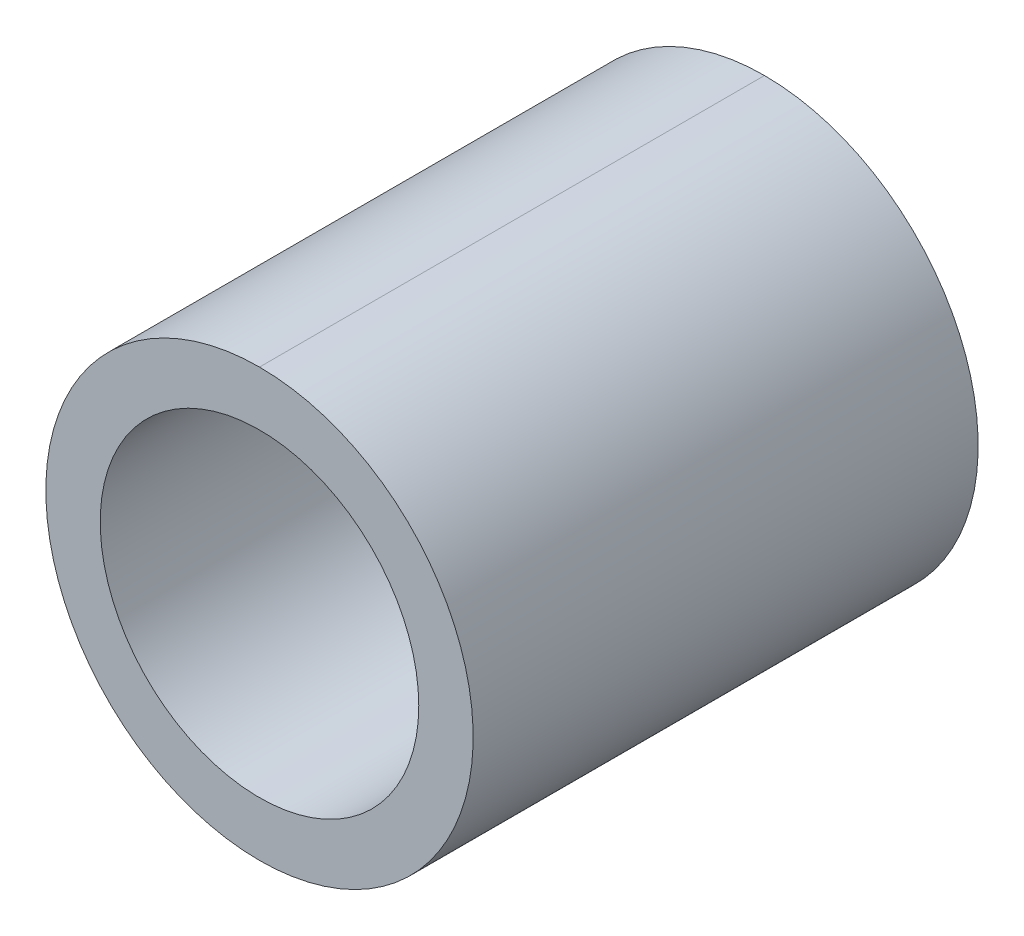
ISO-10303-21;
HEADER;
FILE_DESCRIPTION(('STEP AP214'),'2;1');
FILE_NAME('part.step','',(''),(''),'','','');
FILE_SCHEMA(('AUTOMOTIVE_DESIGN { 1 0 10303 214 1 1 1 1 }'));
ENDSEC;
DATA;
#1=APPLICATION_CONTEXT('core data for automotive mechanical design processes');
#2=APPLICATION_PROTOCOL_DEFINITION('international standard','automotive_design',2000,#1);
#3=PRODUCT_CONTEXT('',#1,'mechanical');
#4=PRODUCT('Part','Part','',(#3));
#5=PRODUCT_RELATED_PRODUCT_CATEGORY('part','',(#4));
#6=PRODUCT_DEFINITION_FORMATION('','',#4);
#7=PRODUCT_DEFINITION_CONTEXT('part definition',#1,'design');
#8=PRODUCT_DEFINITION('design','',#6,#7);
#9=PRODUCT_DEFINITION_SHAPE('','',#8);
#10=(LENGTH_UNIT() NAMED_UNIT(*) SI_UNIT(.MILLI.,.METRE.));
#11=(NAMED_UNIT(*) PLANE_ANGLE_UNIT() SI_UNIT($,.RADIAN.));
#12=(NAMED_UNIT(*) SI_UNIT($,.STERADIAN.) SOLID_ANGLE_UNIT());
#13=UNCERTAINTY_MEASURE_WITH_UNIT(LENGTH_MEASURE(1.E-05),#10,'distance_accuracy_value','');
#14=(GEOMETRIC_REPRESENTATION_CONTEXT(3) GLOBAL_UNCERTAINTY_ASSIGNED_CONTEXT((#13)) GLOBAL_UNIT_ASSIGNED_CONTEXT((#10,
#11,#12)) REPRESENTATION_CONTEXT('',''));
#15=CARTESIAN_POINT('',(0.,0.,0.));
#16=DIRECTION('',(0.,0.,1.));
#17=DIRECTION('',(1.,0.,0.));
#18=AXIS2_PLACEMENT_3D('',#15,#16,#17);
#19=CARTESIAN_POINT('',(0.,0.,130.));
#20=DIRECTION('',(0.,0.,-1.));
#21=DIRECTION('',(-1.,0.,0.));
#22=AXIS2_PLACEMENT_3D('',#19,#20,#21);
#23=CYLINDRICAL_SURFACE('',#22,55.);
#24=DIRECTION('',(0.,0.,-1.));
#25=VECTOR('',#24,1.);
#26=CARTESIAN_POINT('',(0.,55.,130.));
#27=LINE('',#26,#25);
#28=CARTESIAN_POINT('',(0.,55.,130.));
#29=VERTEX_POINT('',#28);
#30=CARTESIAN_POINT('',(0.,55.,0.));
#31=VERTEX_POINT('',#30);
#32=EDGE_CURVE('E11',#29,#31,#27,.T.);
#33=ORIENTED_EDGE('',*,*,#32,.F.);
#34=CARTESIAN_POINT('',(0.,0.,130.));
#35=DIRECTION('',(0.,0.,1.));
#36=DIRECTION('',(1.,0.,0.));
#37=AXIS2_PLACEMENT_3D('',#34,#35,#36);
#38=CIRCLE('',#37,55.);
#39=CARTESIAN_POINT('',(0.,-55.,130.));
#40=VERTEX_POINT('',#39);
#41=EDGE_CURVE('E66',#40,#29,#38,.T.);
#42=ORIENTED_EDGE('',*,*,#41,.F.);
#43=DIRECTION('',(0.,0.,-1.));
#44=VECTOR('',#43,1.);
#45=CARTESIAN_POINT('',(0.,-55.,130.));
#46=LINE('',#45,#44);
#47=CARTESIAN_POINT('',(0.,-55.,0.));
#48=VERTEX_POINT('',#47);
#49=EDGE_CURVE('E49',#48,#40,#46,.F.);
#50=ORIENTED_EDGE('',*,*,#49,.F.);
#51=CARTESIAN_POINT('',(0.,0.,0.));
#52=DIRECTION('',(0.,0.,1.));
#53=DIRECTION('',(1.,0.,0.));
#54=AXIS2_PLACEMENT_3D('',#51,#52,#53);
#55=CIRCLE('',#54,55.);
#56=EDGE_CURVE('E68',#48,#31,#55,.T.);
#57=ORIENTED_EDGE('',*,*,#56,.T.);
#58=EDGE_LOOP('',(#33,#42,#50,#57));
#59=FACE_BOUND('',#58,.T.);
#60=ADVANCED_FACE('F40',(#59),#23,.T.);
#61=EDGE_CURVE('E72',#29,#40,#38,.T.);
#62=ORIENTED_EDGE('',*,*,#61,.F.);
#63=ORIENTED_EDGE('',*,*,#32,.T.);
#64=EDGE_CURVE('E74',#31,#48,#55,.T.);
#65=ORIENTED_EDGE('',*,*,#64,.T.);
#66=ORIENTED_EDGE('',*,*,#49,.T.);
#67=EDGE_LOOP('',(#62,#63,#65,#66));
#68=FACE_BOUND('',#67,.T.);
#69=ADVANCED_FACE('F42',(#68),#23,.T.);
#70=CARTESIAN_POINT('',(0.,0.,130.));
#71=DIRECTION('',(0.,0.,1.));
#72=DIRECTION('',(1.,0.,0.));
#73=AXIS2_PLACEMENT_3D('',#70,#71,#72);
#74=PLANE('',#73);
#75=CARTESIAN_POINT('',(0.,0.,130.));
#76=DIRECTION('',(0.,0.,1.));
#77=DIRECTION('',(1.,0.,0.));
#78=AXIS2_PLACEMENT_3D('',#75,#76,#77);
#79=CIRCLE('',#78,41.);
#80=CARTESIAN_POINT('',(41.,0.,130.));
#81=VERTEX_POINT('',#80);
#82=EDGE_CURVE('E80',#81,#81,#79,.T.);
#83=ORIENTED_EDGE('',*,*,#82,.F.);
#84=EDGE_LOOP('',(#83));
#85=FACE_BOUND('',#84,.T.);
#86=ORIENTED_EDGE('',*,*,#61,.T.);
#87=ORIENTED_EDGE('',*,*,#41,.T.);
#88=EDGE_LOOP('',(#86,#87));
#89=FACE_BOUND('',#88,.T.);
#90=ADVANCED_FACE('F71',(#85,#89),#74,.T.);
#91=CARTESIAN_POINT('',(0.,0.,0.));
#92=DIRECTION('',(0.,0.,1.));
#93=DIRECTION('',(1.,0.,0.));
#94=AXIS2_PLACEMENT_3D('',#91,#92,#93);
#95=PLANE('',#94);
#96=ORIENTED_EDGE('',*,*,#64,.F.);
#97=ORIENTED_EDGE('',*,*,#56,.F.);
#98=EDGE_LOOP('',(#96,#97));
#99=FACE_BOUND('',#98,.T.);
#100=ADVANCED_FACE('F96',(#99),#95,.F.);
#101=CARTESIAN_POINT('',(0.,0.,9.99999999999999));
#102=DIRECTION('',(0.,0.,1.));
#103=DIRECTION('',(1.,0.,0.));
#104=AXIS2_PLACEMENT_3D('',#101,#102,#103);
#105=CYLINDRICAL_SURFACE('',#104,41.);
#106=CARTESIAN_POINT('',(0.,0.,9.99999999999999));
#107=DIRECTION('',(0.,0.,1.));
#108=DIRECTION('',(1.,0.,0.));
#109=AXIS2_PLACEMENT_3D('',#106,#107,#108);
#110=CIRCLE('',#109,41.);
#111=CARTESIAN_POINT('',(41.,0.,9.99999999999999));
#112=VERTEX_POINT('',#111);
#113=EDGE_CURVE('E84',#112,#112,#110,.T.);
#114=CARTESIAN_POINT('',(41.,0.,9.99999999999999));
#115=CARTESIAN_POINT('',(41.,0.,11.25));
#116=CARTESIAN_POINT('',(41.,0.,12.5));
#117=CARTESIAN_POINT('',(41.,0.,15.));
#118=CARTESIAN_POINT('',(41.,0.,16.25));
#119=CARTESIAN_POINT('',(41.,0.,18.75));
#120=CARTESIAN_POINT('',(41.,0.,20.));
#121=CARTESIAN_POINT('',(41.,0.,22.5));
#122=CARTESIAN_POINT('',(41.,0.,23.75));
#123=CARTESIAN_POINT('',(41.,0.,26.25));
#124=CARTESIAN_POINT('',(41.,0.,27.5));
#125=CARTESIAN_POINT('',(41.,0.,30.));
#126=CARTESIAN_POINT('',(41.,0.,31.25));
#127=CARTESIAN_POINT('',(41.,0.,33.75));
#128=CARTESIAN_POINT('',(41.,0.,35.));
#129=CARTESIAN_POINT('',(41.,0.,37.5));
#130=CARTESIAN_POINT('',(41.,0.,38.75));
#131=CARTESIAN_POINT('',(41.,0.,41.25));
#132=CARTESIAN_POINT('',(41.,0.,42.5));
#133=CARTESIAN_POINT('',(41.,0.,45.));
#134=CARTESIAN_POINT('',(41.,0.,46.25));
#135=CARTESIAN_POINT('',(41.,0.,48.75));
#136=CARTESIAN_POINT('',(41.,0.,50.));
#137=CARTESIAN_POINT('',(41.,0.,52.5));
#138=CARTESIAN_POINT('',(41.,0.,53.75));
#139=CARTESIAN_POINT('',(41.,0.,56.25));
#140=CARTESIAN_POINT('',(41.,0.,57.5));
#141=CARTESIAN_POINT('',(41.,0.,60.));
#142=CARTESIAN_POINT('',(41.,0.,61.25));
#143=CARTESIAN_POINT('',(41.,0.,63.75));
#144=CARTESIAN_POINT('',(41.,0.,65.));
#145=CARTESIAN_POINT('',(41.,0.,67.5));
#146=CARTESIAN_POINT('',(41.,0.,68.75));
#147=CARTESIAN_POINT('',(41.,0.,71.25));
#148=CARTESIAN_POINT('',(41.,0.,72.5));
#149=CARTESIAN_POINT('',(41.,0.,75.));
#150=CARTESIAN_POINT('',(41.,0.,76.25));
#151=CARTESIAN_POINT('',(41.,0.,78.75));
#152=CARTESIAN_POINT('',(41.,0.,80.));
#153=CARTESIAN_POINT('',(41.,0.,82.5));
#154=CARTESIAN_POINT('',(41.,0.,83.75));
#155=CARTESIAN_POINT('',(41.,0.,86.25));
#156=CARTESIAN_POINT('',(41.,0.,87.5));
#157=CARTESIAN_POINT('',(41.,0.,90.));
#158=CARTESIAN_POINT('',(41.,0.,91.25));
#159=CARTESIAN_POINT('',(41.,0.,93.75));
#160=CARTESIAN_POINT('',(41.,0.,95.));
#161=CARTESIAN_POINT('',(41.,0.,97.5));
#162=CARTESIAN_POINT('',(41.,0.,98.75));
#163=CARTESIAN_POINT('',(41.,0.,101.25));
#164=CARTESIAN_POINT('',(41.,0.,102.5));
#165=CARTESIAN_POINT('',(41.,0.,105.));
#166=CARTESIAN_POINT('',(41.,0.,106.25));
#167=CARTESIAN_POINT('',(41.,0.,108.75));
#168=CARTESIAN_POINT('',(41.,0.,110.));
#169=CARTESIAN_POINT('',(41.,0.,112.5));
#170=CARTESIAN_POINT('',(41.,0.,113.75));
#171=CARTESIAN_POINT('',(41.,0.,116.25));
#172=CARTESIAN_POINT('',(41.,0.,117.5));
#173=CARTESIAN_POINT('',(41.,0.,120.));
#174=CARTESIAN_POINT('',(41.,0.,121.25));
#175=CARTESIAN_POINT('',(41.,0.,123.75));
#176=CARTESIAN_POINT('',(41.,0.,125.));
#177=CARTESIAN_POINT('',(41.,0.,127.5));
#178=CARTESIAN_POINT('',(41.,0.,128.75));
#179=CARTESIAN_POINT('',(41.,0.,130.));
#180=B_SPLINE_CURVE_WITH_KNOTS('',3,(#114,#115,#116,#117,#118,#119,#120,#121,#122,#123,#124,
#125,#126,#127,#128,#129,#130,#131,#132,#133,#134,#135,#136,#137,#138,#139,#140,#141,#142,#143,
#144,#145,#146,#147,#148,#149,#150,#151,#152,#153,#154,#155,#156,#157,#158,#159,#160,#161,#162,
#163,#164,#165,#166,#167,#168,#169,#170,#171,#172,#173,#174,#175,#176,#177,#178,#179),
.UNSPECIFIED.,.F.,.F.,(4,2,2,2,2,2,2,2,2,2,2,2,2,2,2,2,2,2,2,2,2,2,2,2,2,2,2,2,2,2,2,2,4),(0.,
3.75,7.5,11.25,15.,18.75,22.5,26.25,30.,33.75,37.5,41.25,45.,48.75,52.5,56.25,60.,63.75,67.5,
71.25,75.,78.75,82.5,86.25,90.,93.75,97.5,101.25,105.,108.75,112.5,116.25,120.),.UNSPECIFIED.);
#181=EDGE_CURVE('BSEAM93',#112,#81,#180,.T.);
#182=ORIENTED_EDGE('',*,*,#113,.F.);
#183=ORIENTED_EDGE('',*,*,#82,.T.);
#184=ORIENTED_EDGE('',*,*,#181,.T.);
#185=ORIENTED_EDGE('',*,*,#181,.F.);
#186=EDGE_LOOP('',(#182,#184,#183,#185));
#187=FACE_BOUND('',#186,.T.);
#188=ADVANCED_FACE('F93',(#187),#105,.F.);
#189=CARTESIAN_POINT('',(0.,0.,9.99999999999999));
#190=DIRECTION('',(0.,0.,1.));
#191=DIRECTION('',(1.,0.,0.));
#192=AXIS2_PLACEMENT_3D('',#189,#190,#191);
#193=PLANE('',#192);
#194=ORIENTED_EDGE('',*,*,#113,.T.);
#195=EDGE_LOOP('',(#194));
#196=FACE_BOUND('',#195,.T.);
#197=ADVANCED_FACE('F132',(#196),#193,.T.);
#198=CLOSED_SHELL('',(#60,#69,#90,#100,#188,#197));
#199=MANIFOLD_SOLID_BREP('B2',#198);
#200=ADVANCED_BREP_SHAPE_REPRESENTATION('',(#18,#199),#14);
#201=SHAPE_DEFINITION_REPRESENTATION(#9,#200);
ENDSEC;
END-ISO-10303-21;
